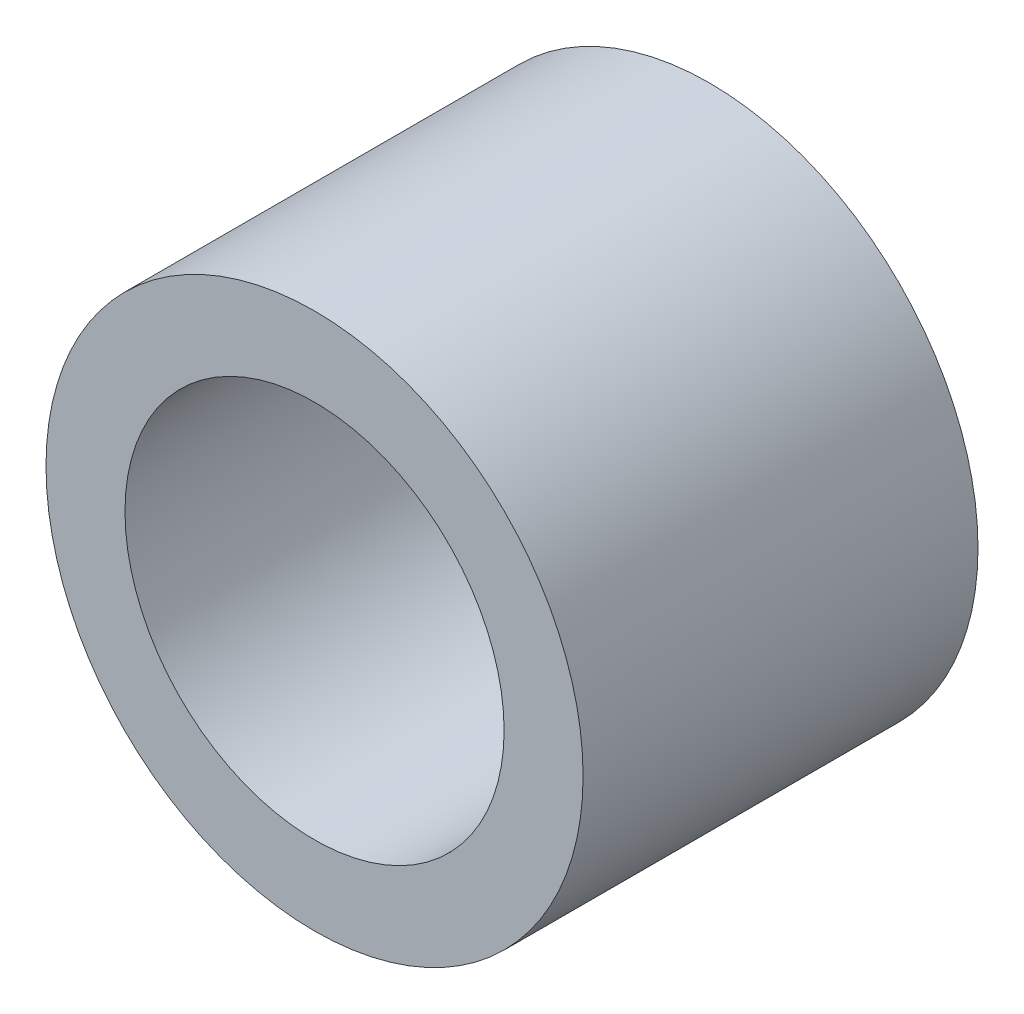
ISO-10303-21;
HEADER;
FILE_DESCRIPTION(('STEP AP214'),'2;1');
FILE_NAME('part.step','',(''),(''),'','','');
FILE_SCHEMA(('AUTOMOTIVE_DESIGN { 1 0 10303 214 1 1 1 1 }'));
ENDSEC;
DATA;
#1=APPLICATION_CONTEXT('core data for automotive mechanical design processes');
#2=APPLICATION_PROTOCOL_DEFINITION('international standard','automotive_design',2000,#1);
#3=PRODUCT_CONTEXT('',#1,'mechanical');
#4=PRODUCT('Part','Part','',(#3));
#5=PRODUCT_RELATED_PRODUCT_CATEGORY('part','',(#4));
#6=PRODUCT_DEFINITION_FORMATION('','',#4);
#7=PRODUCT_DEFINITION_CONTEXT('part definition',#1,'design');
#8=PRODUCT_DEFINITION('design','',#6,#7);
#9=PRODUCT_DEFINITION_SHAPE('','',#8);
#10=(LENGTH_UNIT() NAMED_UNIT(*) SI_UNIT(.MILLI.,.METRE.));
#11=(NAMED_UNIT(*) PLANE_ANGLE_UNIT() SI_UNIT($,.RADIAN.));
#12=(NAMED_UNIT(*) SI_UNIT($,.STERADIAN.) SOLID_ANGLE_UNIT());
#13=UNCERTAINTY_MEASURE_WITH_UNIT(LENGTH_MEASURE(1.E-05),#10,'distance_accuracy_value','');
#14=(GEOMETRIC_REPRESENTATION_CONTEXT(3) GLOBAL_UNCERTAINTY_ASSIGNED_CONTEXT((#13)) GLOBAL_UNIT_ASSIGNED_CONTEXT((#10,
#11,#12)) REPRESENTATION_CONTEXT('',''));
#15=CARTESIAN_POINT('',(0.,0.,0.));
#16=DIRECTION('',(0.,0.,1.));
#17=DIRECTION('',(1.,0.,0.));
#18=AXIS2_PLACEMENT_3D('',#15,#16,#17);
#19=CARTESIAN_POINT('',(-7.21644966006352E-13,0.,25.0000000000001));
#20=DIRECTION('',(0.,0.,0.999999999999996));
#21=DIRECTION('',(1.00000000000001,0.,0.));
#22=AXIS2_PLACEMENT_3D('',#19,#20,#21);
#23=PLANE('',#22);
#24=CARTESIAN_POINT('',(-7.21644966006352E-13,0.,25.0000000000001));
#25=DIRECTION('',(0.,0.,0.999999999999996));
#26=DIRECTION('',(1.00000000000001,0.,0.));
#27=AXIS2_PLACEMENT_3D('',#24,#25,#26);
#28=CIRCLE('',#27,17.);
#29=CARTESIAN_POINT('',(-17.0000000000009,0.,25.0000000000001));
#30=VERTEX_POINT('',#29);
#31=EDGE_CURVE('E10',#30,#30,#28,.T.);
#32=ORIENTED_EDGE('',*,*,#31,.T.);
#33=EDGE_LOOP('',(#32));
#34=FACE_BOUND('',#33,.T.);
#35=CARTESIAN_POINT('',(-7.21644966006352E-13,0.,25.0000000000001));
#36=DIRECTION('',(0.,0.,0.999999999999996));
#37=DIRECTION('',(1.00000000000001,0.,0.));
#38=AXIS2_PLACEMENT_3D('',#35,#36,#37);
#39=CIRCLE('',#38,12.);
#40=CARTESIAN_POINT('',(-12.0000000000009,0.,25.0000000000001));
#41=VERTEX_POINT('',#40);
#42=EDGE_CURVE('E46',#41,#41,#39,.T.);
#43=ORIENTED_EDGE('',*,*,#42,.F.);
#44=EDGE_LOOP('',(#43));
#45=FACE_BOUND('',#44,.T.);
#46=ADVANCED_FACE('F32',(#34,#45),#23,.T.);
#47=CARTESIAN_POINT('',(0.,0.,0.));
#48=DIRECTION('',(0.,0.,0.999999999999996));
#49=DIRECTION('',(1.00000000000001,0.,0.));
#50=AXIS2_PLACEMENT_3D('',#47,#48,#49);
#51=PLANE('',#50);
#52=CARTESIAN_POINT('',(0.,0.,0.));
#53=DIRECTION('',(0.,0.,0.999999999999996));
#54=DIRECTION('',(1.00000000000001,0.,0.));
#55=AXIS2_PLACEMENT_3D('',#52,#53,#54);
#56=CIRCLE('',#55,17.);
#57=CARTESIAN_POINT('',(-17.0000000000009,0.,0.));
#58=VERTEX_POINT('',#57);
#59=EDGE_CURVE('E36',#58,#58,#56,.T.);
#60=ORIENTED_EDGE('',*,*,#59,.F.);
#61=EDGE_LOOP('',(#60));
#62=FACE_BOUND('',#61,.T.);
#63=CARTESIAN_POINT('',(0.,0.,0.));
#64=DIRECTION('',(0.,0.,0.999999999999996));
#65=DIRECTION('',(1.00000000000001,0.,0.));
#66=AXIS2_PLACEMENT_3D('',#63,#64,#65);
#67=CIRCLE('',#66,12.);
#68=CARTESIAN_POINT('',(-12.0000000000009,0.,0.));
#69=VERTEX_POINT('',#68);
#70=EDGE_CURVE('E48',#69,#69,#67,.T.);
#71=ORIENTED_EDGE('',*,*,#70,.T.);
#72=EDGE_LOOP('',(#71));
#73=FACE_BOUND('',#72,.T.);
#74=ADVANCED_FACE('F61',(#62,#73),#51,.F.);
#75=CARTESIAN_POINT('',(-7.21644966006352E-13,0.,25.0000000000001));
#76=DIRECTION('',(0.,0.,-0.999999999999996));
#77=DIRECTION('',(-1.00000000000001,0.,0.));
#78=AXIS2_PLACEMENT_3D('',#75,#76,#77);
#79=CYLINDRICAL_SURFACE('',#78,17.);
#80=CARTESIAN_POINT('',(-17.0000000000009,0.,25.0000000000001));
#81=CARTESIAN_POINT('',(-17.0000000000009,0.,24.7395833333335));
#82=CARTESIAN_POINT('',(-17.0000000000009,0.,24.4791666666668));
#83=CARTESIAN_POINT('',(-17.0000000000009,0.,23.9583333333335));
#84=CARTESIAN_POINT('',(-17.0000000000009,0.,23.6979166666668));
#85=CARTESIAN_POINT('',(-17.0000000000009,0.,23.1770833333335));
#86=CARTESIAN_POINT('',(-17.0000000000009,0.,22.9166666666668));
#87=CARTESIAN_POINT('',(-17.0000000000009,0.,22.3958333333335));
#88=CARTESIAN_POINT('',(-17.0000000000009,0.,22.1354166666668));
#89=CARTESIAN_POINT('',(-17.0000000000009,0.,21.6145833333334));
#90=CARTESIAN_POINT('',(-17.0000000000009,0.,21.3541666666668));
#91=CARTESIAN_POINT('',(-17.0000000000009,0.,20.8333333333334));
#92=CARTESIAN_POINT('',(-17.0000000000009,0.,20.5729166666668));
#93=CARTESIAN_POINT('',(-17.0000000000009,0.,20.0520833333334));
#94=CARTESIAN_POINT('',(-17.0000000000009,0.,19.7916666666668));
#95=CARTESIAN_POINT('',(-17.0000000000009,0.,19.2708333333334));
#96=CARTESIAN_POINT('',(-17.0000000000009,0.,19.0104166666668));
#97=CARTESIAN_POINT('',(-17.0000000000009,0.,18.4895833333334));
#98=CARTESIAN_POINT('',(-17.0000000000009,0.,18.2291666666668));
#99=CARTESIAN_POINT('',(-17.0000000000009,0.,17.7083333333334));
#100=CARTESIAN_POINT('',(-17.0000000000009,0.,17.4479166666668));
#101=CARTESIAN_POINT('',(-17.0000000000009,0.,16.9270833333334));
#102=CARTESIAN_POINT('',(-17.0000000000009,0.,16.6666666666668));
#103=CARTESIAN_POINT('',(-17.0000000000009,0.,16.1458333333334));
#104=CARTESIAN_POINT('',(-17.0000000000009,0.,15.8854166666668));
#105=CARTESIAN_POINT('',(-17.0000000000009,0.,15.3645833333334));
#106=CARTESIAN_POINT('',(-17.0000000000009,0.,15.1041666666667));
#107=CARTESIAN_POINT('',(-17.0000000000009,0.,14.5833333333334));
#108=CARTESIAN_POINT('',(-17.0000000000009,0.,14.3229166666667));
#109=CARTESIAN_POINT('',(-17.0000000000009,0.,13.8020833333334));
#110=CARTESIAN_POINT('',(-17.0000000000009,0.,13.5416666666667));
#111=CARTESIAN_POINT('',(-17.0000000000009,0.,13.0208333333334));
#112=CARTESIAN_POINT('',(-17.0000000000009,0.,12.7604166666667));
#113=CARTESIAN_POINT('',(-17.0000000000009,0.,12.2395833333334));
#114=CARTESIAN_POINT('',(-17.0000000000009,0.,11.9791666666667));
#115=CARTESIAN_POINT('',(-17.0000000000009,0.,11.4583333333334));
#116=CARTESIAN_POINT('',(-17.0000000000009,0.,11.1979166666667));
#117=CARTESIAN_POINT('',(-17.0000000000009,0.,10.6770833333334));
#118=CARTESIAN_POINT('',(-17.0000000000009,0.,10.4166666666667));
#119=CARTESIAN_POINT('',(-17.0000000000009,0.,9.89583333333338));
#120=CARTESIAN_POINT('',(-17.0000000000009,0.,9.63541666666672));
#121=CARTESIAN_POINT('',(-17.0000000000009,0.,9.11458333333338));
#122=CARTESIAN_POINT('',(-17.0000000000009,0.,8.85416666666671));
#123=CARTESIAN_POINT('',(-17.0000000000009,0.,8.33333333333337));
#124=CARTESIAN_POINT('',(-17.0000000000009,0.,8.07291666666671));
#125=CARTESIAN_POINT('',(-17.0000000000009,0.,7.55208333333337));
#126=CARTESIAN_POINT('',(-17.0000000000009,0.,7.2916666666667));
#127=CARTESIAN_POINT('',(-17.0000000000009,0.,6.77083333333337));
#128=CARTESIAN_POINT('',(-17.0000000000009,0.,6.5104166666667));
#129=CARTESIAN_POINT('',(-17.0000000000009,0.,5.98958333333336));
#130=CARTESIAN_POINT('',(-17.0000000000009,0.,5.72916666666669));
#131=CARTESIAN_POINT('',(-17.0000000000009,0.,5.20833333333336));
#132=CARTESIAN_POINT('',(-17.0000000000009,0.,4.94791666666669));
#133=CARTESIAN_POINT('',(-17.0000000000009,0.,4.42708333333335));
#134=CARTESIAN_POINT('',(-17.0000000000009,0.,4.16666666666668));
#135=CARTESIAN_POINT('',(-17.0000000000009,0.,3.64583333333335));
#136=CARTESIAN_POINT('',(-17.0000000000009,0.,3.38541666666668));
#137=CARTESIAN_POINT('',(-17.0000000000009,0.,2.86458333333335));
#138=CARTESIAN_POINT('',(-17.0000000000009,0.,2.60416666666668));
#139=CARTESIAN_POINT('',(-17.0000000000009,0.,2.08333333333334));
#140=CARTESIAN_POINT('',(-17.0000000000009,0.,1.82291666666667));
#141=CARTESIAN_POINT('',(-17.0000000000009,0.,1.30208333333334));
#142=CARTESIAN_POINT('',(-17.0000000000009,0.,1.04166666666667));
#143=CARTESIAN_POINT('',(-17.0000000000009,0.,0.520833333333333));
#144=CARTESIAN_POINT('',(-17.0000000000009,0.,0.260416666666665));
#145=CARTESIAN_POINT('',(-17.0000000000009,0.,0.));
#146=B_SPLINE_CURVE_WITH_KNOTS('',3,(#80,#81,#82,#83,#84,#85,#86,#87,#88,#89,#90,#91,#92,#93,
#94,#95,#96,#97,#98,#99,#100,#101,#102,#103,#104,#105,#106,#107,#108,#109,#110,#111,#112,#113,
#114,#115,#116,#117,#118,#119,#120,#121,#122,#123,#124,#125,#126,#127,#128,#129,#130,#131,#132,
#133,#134,#135,#136,#137,#138,#139,#140,#141,#142,#143,#144,#145),.UNSPECIFIED.,.F.,.F.,(4,2,2,
2,2,2,2,2,2,2,2,2,2,2,2,2,2,2,2,2,2,2,2,2,2,2,2,2,2,2,2,2,4),(0.,0.781250000000001,1.5625,
2.34375000000001,3.12500000000001,3.90625000000002,4.68750000000002,5.46875000000003,
6.25000000000003,7.03125000000004,7.81250000000004,8.59375000000004,9.37500000000005,
10.1562500000001,10.9375000000001,11.7187500000001,12.5000000000001,13.2812500000001,
14.0625000000001,14.8437500000001,15.6250000000001,16.4062500000001,17.1875000000001,
17.9687500000001,18.7500000000001,19.5312500000001,20.3125000000001,21.0937500000001,
21.8750000000001,22.6562500000001,23.4375000000001,24.2187500000001,25.0000000000001),.UNSPECIFIED.);
#147=EDGE_CURVE('BSEAM34',#30,#58,#146,.T.);
#148=ORIENTED_EDGE('',*,*,#31,.F.);
#149=ORIENTED_EDGE('',*,*,#59,.T.);
#150=ORIENTED_EDGE('',*,*,#147,.T.);
#151=ORIENTED_EDGE('',*,*,#147,.F.);
#152=EDGE_LOOP('',(#148,#150,#149,#151));
#153=FACE_BOUND('',#152,.T.);
#154=ADVANCED_FACE('F34',(#153),#79,.T.);
#155=CARTESIAN_POINT('',(-7.21644966006352E-13,0.,25.0000000000001));
#156=DIRECTION('',(0.,0.,-0.999999999999996));
#157=DIRECTION('',(-1.00000000000001,0.,0.));
#158=AXIS2_PLACEMENT_3D('',#155,#156,#157);
#159=CYLINDRICAL_SURFACE('',#158,12.);
#160=CARTESIAN_POINT('',(-12.0000000000009,0.,25.0000000000001));
#161=CARTESIAN_POINT('',(-12.0000000000009,0.,24.7395833333335));
#162=CARTESIAN_POINT('',(-12.0000000000009,0.,24.4791666666668));
#163=CARTESIAN_POINT('',(-12.0000000000009,0.,23.9583333333335));
#164=CARTESIAN_POINT('',(-12.0000000000009,0.,23.6979166666668));
#165=CARTESIAN_POINT('',(-12.0000000000009,0.,23.1770833333335));
#166=CARTESIAN_POINT('',(-12.0000000000009,0.,22.9166666666668));
#167=CARTESIAN_POINT('',(-12.0000000000009,0.,22.3958333333335));
#168=CARTESIAN_POINT('',(-12.0000000000009,0.,22.1354166666668));
#169=CARTESIAN_POINT('',(-12.0000000000009,0.,21.6145833333334));
#170=CARTESIAN_POINT('',(-12.0000000000009,0.,21.3541666666668));
#171=CARTESIAN_POINT('',(-12.0000000000009,0.,20.8333333333334));
#172=CARTESIAN_POINT('',(-12.0000000000009,0.,20.5729166666668));
#173=CARTESIAN_POINT('',(-12.0000000000009,0.,20.0520833333334));
#174=CARTESIAN_POINT('',(-12.0000000000009,0.,19.7916666666668));
#175=CARTESIAN_POINT('',(-12.0000000000009,0.,19.2708333333334));
#176=CARTESIAN_POINT('',(-12.0000000000009,0.,19.0104166666668));
#177=CARTESIAN_POINT('',(-12.0000000000009,0.,18.4895833333334));
#178=CARTESIAN_POINT('',(-12.0000000000009,0.,18.2291666666668));
#179=CARTESIAN_POINT('',(-12.0000000000009,0.,17.7083333333334));
#180=CARTESIAN_POINT('',(-12.0000000000009,0.,17.4479166666668));
#181=CARTESIAN_POINT('',(-12.0000000000009,0.,16.9270833333334));
#182=CARTESIAN_POINT('',(-12.0000000000009,0.,16.6666666666668));
#183=CARTESIAN_POINT('',(-12.0000000000009,0.,16.1458333333334));
#184=CARTESIAN_POINT('',(-12.0000000000009,0.,15.8854166666668));
#185=CARTESIAN_POINT('',(-12.0000000000009,0.,15.3645833333334));
#186=CARTESIAN_POINT('',(-12.0000000000009,0.,15.1041666666667));
#187=CARTESIAN_POINT('',(-12.0000000000009,0.,14.5833333333334));
#188=CARTESIAN_POINT('',(-12.0000000000009,0.,14.3229166666667));
#189=CARTESIAN_POINT('',(-12.0000000000009,0.,13.8020833333334));
#190=CARTESIAN_POINT('',(-12.0000000000009,0.,13.5416666666667));
#191=CARTESIAN_POINT('',(-12.0000000000009,0.,13.0208333333334));
#192=CARTESIAN_POINT('',(-12.0000000000009,0.,12.7604166666667));
#193=CARTESIAN_POINT('',(-12.0000000000009,0.,12.2395833333334));
#194=CARTESIAN_POINT('',(-12.0000000000009,0.,11.9791666666667));
#195=CARTESIAN_POINT('',(-12.0000000000009,0.,11.4583333333334));
#196=CARTESIAN_POINT('',(-12.0000000000009,0.,11.1979166666667));
#197=CARTESIAN_POINT('',(-12.0000000000009,0.,10.6770833333334));
#198=CARTESIAN_POINT('',(-12.0000000000009,0.,10.4166666666667));
#199=CARTESIAN_POINT('',(-12.0000000000009,0.,9.89583333333338));
#200=CARTESIAN_POINT('',(-12.0000000000009,0.,9.63541666666672));
#201=CARTESIAN_POINT('',(-12.0000000000009,0.,9.11458333333338));
#202=CARTESIAN_POINT('',(-12.0000000000009,0.,8.85416666666671));
#203=CARTESIAN_POINT('',(-12.0000000000009,0.,8.33333333333337));
#204=CARTESIAN_POINT('',(-12.0000000000009,0.,8.07291666666671));
#205=CARTESIAN_POINT('',(-12.0000000000009,0.,7.55208333333337));
#206=CARTESIAN_POINT('',(-12.0000000000009,0.,7.2916666666667));
#207=CARTESIAN_POINT('',(-12.0000000000009,0.,6.77083333333337));
#208=CARTESIAN_POINT('',(-12.0000000000009,0.,6.5104166666667));
#209=CARTESIAN_POINT('',(-12.0000000000009,0.,5.98958333333336));
#210=CARTESIAN_POINT('',(-12.0000000000009,0.,5.72916666666669));
#211=CARTESIAN_POINT('',(-12.0000000000009,0.,5.20833333333336));
#212=CARTESIAN_POINT('',(-12.0000000000009,0.,4.94791666666669));
#213=CARTESIAN_POINT('',(-12.0000000000009,0.,4.42708333333335));
#214=CARTESIAN_POINT('',(-12.0000000000009,0.,4.16666666666668));
#215=CARTESIAN_POINT('',(-12.0000000000009,0.,3.64583333333335));
#216=CARTESIAN_POINT('',(-12.0000000000009,0.,3.38541666666668));
#217=CARTESIAN_POINT('',(-12.0000000000009,0.,2.86458333333335));
#218=CARTESIAN_POINT('',(-12.0000000000009,0.,2.60416666666668));
#219=CARTESIAN_POINT('',(-12.0000000000009,0.,2.08333333333334));
#220=CARTESIAN_POINT('',(-12.0000000000009,0.,1.82291666666667));
#221=CARTESIAN_POINT('',(-12.0000000000009,0.,1.30208333333334));
#222=CARTESIAN_POINT('',(-12.0000000000009,0.,1.04166666666667));
#223=CARTESIAN_POINT('',(-12.0000000000009,0.,0.520833333333333));
#224=CARTESIAN_POINT('',(-12.0000000000009,0.,0.260416666666665));
#225=CARTESIAN_POINT('',(-12.0000000000009,0.,0.));
#226=B_SPLINE_CURVE_WITH_KNOTS('',3,(#160,#161,#162,#163,#164,#165,#166,#167,#168,#169,#170,
#171,#172,#173,#174,#175,#176,#177,#178,#179,#180,#181,#182,#183,#184,#185,#186,#187,#188,#189,
#190,#191,#192,#193,#194,#195,#196,#197,#198,#199,#200,#201,#202,#203,#204,#205,#206,#207,#208,
#209,#210,#211,#212,#213,#214,#215,#216,#217,#218,#219,#220,#221,#222,#223,#224,#225),
.UNSPECIFIED.,.F.,.F.,(4,2,2,2,2,2,2,2,2,2,2,2,2,2,2,2,2,2,2,2,2,2,2,2,2,2,2,2,2,2,2,2,4),(0.,
0.781250000000001,1.5625,2.34375000000001,3.12500000000001,3.90625000000002,4.68750000000002,
5.46875000000003,6.25000000000003,7.03125000000004,7.81250000000004,8.59375000000004,
9.37500000000005,10.1562500000001,10.9375000000001,11.7187500000001,12.5000000000001,
13.2812500000001,14.0625000000001,14.8437500000001,15.6250000000001,16.4062500000001,
17.1875000000001,17.9687500000001,18.7500000000001,19.5312500000001,20.3125000000001,
21.0937500000001,21.8750000000001,22.6562500000001,23.4375000000001,24.2187500000001,
25.0000000000001),.UNSPECIFIED.);
#227=EDGE_CURVE('BSEAM57',#41,#69,#226,.T.);
#228=ORIENTED_EDGE('',*,*,#42,.T.);
#229=ORIENTED_EDGE('',*,*,#70,.F.);
#230=ORIENTED_EDGE('',*,*,#227,.T.);
#231=ORIENTED_EDGE('',*,*,#227,.F.);
#232=EDGE_LOOP('',(#228,#230,#229,#231));
#233=FACE_BOUND('',#232,.T.);
#234=ADVANCED_FACE('F57',(#233),#159,.F.);
#235=CLOSED_SHELL('',(#46,#74,#154,#234));
#236=MANIFOLD_SOLID_BREP('B2',#235);
#237=ADVANCED_BREP_SHAPE_REPRESENTATION('',(#18,#236),#14);
#238=SHAPE_DEFINITION_REPRESENTATION(#9,#237);
ENDSEC;
END-ISO-10303-21;
